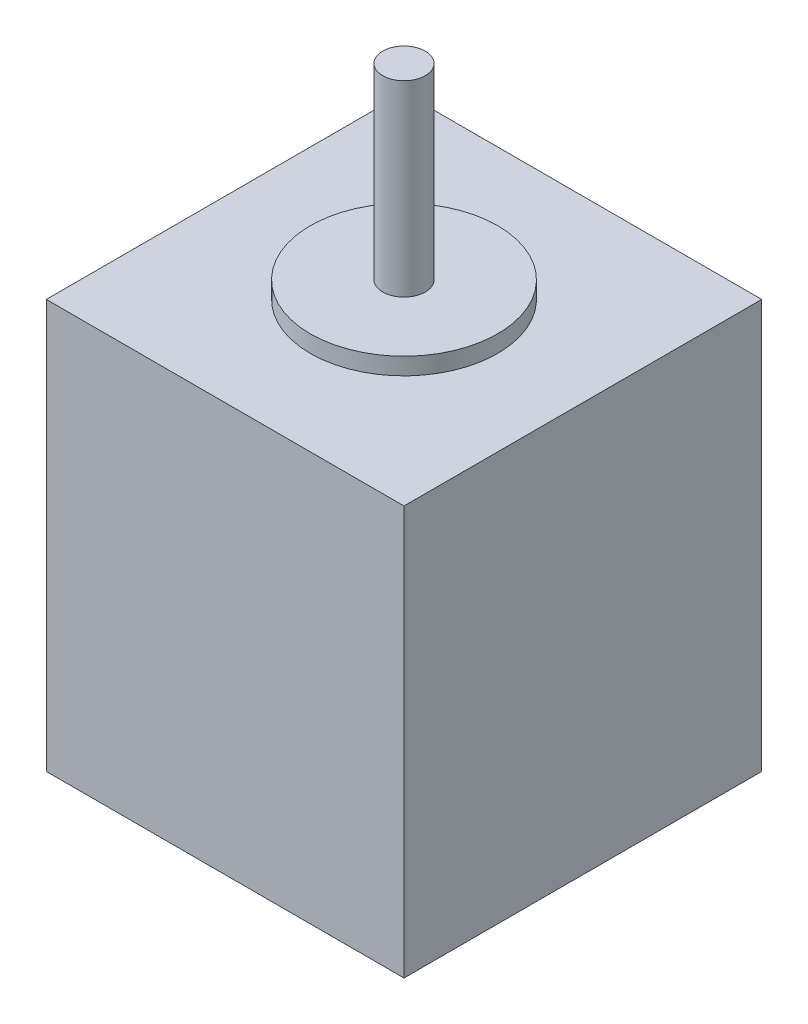
ISO-10303-21;
HEADER;
FILE_DESCRIPTION(('STEP AP214'),'2;1');
FILE_NAME('part.step','',(''),(''),'','','');
FILE_SCHEMA(('AUTOMOTIVE_DESIGN { 1 0 10303 214 1 1 1 1 }'));
ENDSEC;
DATA;
#1=APPLICATION_CONTEXT('core data for automotive mechanical design processes');
#2=APPLICATION_PROTOCOL_DEFINITION('international standard','automotive_design',2000,#1);
#3=PRODUCT_CONTEXT('',#1,'mechanical');
#4=PRODUCT('Part','Part','',(#3));
#5=PRODUCT_RELATED_PRODUCT_CATEGORY('part','',(#4));
#6=PRODUCT_DEFINITION_FORMATION('','',#4);
#7=PRODUCT_DEFINITION_CONTEXT('part definition',#1,'design');
#8=PRODUCT_DEFINITION('design','',#6,#7);
#9=PRODUCT_DEFINITION_SHAPE('','',#8);
#10=(LENGTH_UNIT() NAMED_UNIT(*) SI_UNIT(.MILLI.,.METRE.));
#11=(NAMED_UNIT(*) PLANE_ANGLE_UNIT() SI_UNIT($,.RADIAN.));
#12=(NAMED_UNIT(*) SI_UNIT($,.STERADIAN.) SOLID_ANGLE_UNIT());
#13=UNCERTAINTY_MEASURE_WITH_UNIT(LENGTH_MEASURE(1.E-05),#10,'distance_accuracy_value','');
#14=(GEOMETRIC_REPRESENTATION_CONTEXT(3) GLOBAL_UNCERTAINTY_ASSIGNED_CONTEXT((#13)) GLOBAL_UNIT_ASSIGNED_CONTEXT((#10,
#11,#12)) REPRESENTATION_CONTEXT('',''));
#15=CARTESIAN_POINT('',(0.,0.,0.));
#16=DIRECTION('',(0.,0.,1.));
#17=DIRECTION('',(1.,0.,0.));
#18=AXIS2_PLACEMENT_3D('',#15,#16,#17);
#19=CARTESIAN_POINT('',(-21.,-48.,21.));
#20=DIRECTION('',(0.,0.,1.));
#21=DIRECTION('',(1.,0.,0.));
#22=AXIS2_PLACEMENT_3D('',#19,#20,#21);
#23=PLANE('',#22);
#24=DIRECTION('',(1.,0.,0.));
#25=VECTOR('',#24,1.);
#26=CARTESIAN_POINT('',(-21.,0.,21.));
#27=LINE('',#26,#25);
#28=CARTESIAN_POINT('',(-21.,0.,21.));
#29=VERTEX_POINT('',#28);
#30=CARTESIAN_POINT('',(21.,0.,21.));
#31=VERTEX_POINT('',#30);
#32=EDGE_CURVE('E119',#29,#31,#27,.T.);
#33=ORIENTED_EDGE('',*,*,#32,.F.);
#34=DIRECTION('',(0.,1.,0.));
#35=VECTOR('',#34,1.);
#36=CARTESIAN_POINT('',(-21.,-48.,21.));
#37=LINE('',#36,#35);
#38=CARTESIAN_POINT('',(-21.,-48.,21.));
#39=VERTEX_POINT('',#38);
#40=EDGE_CURVE('E64',#39,#29,#37,.T.);
#41=ORIENTED_EDGE('',*,*,#40,.F.);
#42=DIRECTION('',(1.,0.,0.));
#43=VECTOR('',#42,1.);
#44=CARTESIAN_POINT('',(-21.,-48.,21.));
#45=LINE('',#44,#43);
#46=CARTESIAN_POINT('',(21.,-48.,21.));
#47=VERTEX_POINT('',#46);
#48=EDGE_CURVE('E110',#39,#47,#45,.T.);
#49=ORIENTED_EDGE('',*,*,#48,.T.);
#50=DIRECTION('',(0.,1.,0.));
#51=VECTOR('',#50,1.);
#52=CARTESIAN_POINT('',(21.,-48.,21.));
#53=LINE('',#52,#51);
#54=EDGE_CURVE('E48',#47,#31,#53,.T.);
#55=ORIENTED_EDGE('',*,*,#54,.T.);
#56=EDGE_LOOP('',(#33,#41,#49,#55));
#57=FACE_BOUND('',#56,.T.);
#58=ADVANCED_FACE('F45',(#57),#23,.T.);
#59=CARTESIAN_POINT('',(-21.,-48.,-21.));
#60=DIRECTION('',(-1.,0.,0.));
#61=DIRECTION('',(0.,0.,1.));
#62=AXIS2_PLACEMENT_3D('',#59,#60,#61);
#63=PLANE('',#62);
#64=DIRECTION('',(0.,0.,1.));
#65=VECTOR('',#64,1.);
#66=CARTESIAN_POINT('',(-21.,0.,-21.));
#67=LINE('',#66,#65);
#68=CARTESIAN_POINT('',(-21.,0.,-21.));
#69=VERTEX_POINT('',#68);
#70=EDGE_CURVE('E113',#69,#29,#67,.T.);
#71=ORIENTED_EDGE('',*,*,#70,.F.);
#72=DIRECTION('',(0.,1.,0.));
#73=VECTOR('',#72,1.);
#74=CARTESIAN_POINT('',(-21.,-48.,-21.));
#75=LINE('',#74,#73);
#76=CARTESIAN_POINT('',(-21.,-48.,-21.));
#77=VERTEX_POINT('',#76);
#78=EDGE_CURVE('E80',#77,#69,#75,.T.);
#79=ORIENTED_EDGE('',*,*,#78,.F.);
#80=DIRECTION('',(0.,0.,1.));
#81=VECTOR('',#80,1.);
#82=CARTESIAN_POINT('',(-21.,-48.,-21.));
#83=LINE('',#82,#81);
#84=EDGE_CURVE('E97',#77,#39,#83,.T.);
#85=ORIENTED_EDGE('',*,*,#84,.T.);
#86=ORIENTED_EDGE('',*,*,#40,.T.);
#87=EDGE_LOOP('',(#71,#79,#85,#86));
#88=FACE_BOUND('',#87,.T.);
#89=ADVANCED_FACE('F139',(#88),#63,.T.);
#90=CARTESIAN_POINT('',(-21.,-48.,-21.));
#91=DIRECTION('',(0.,0.,1.));
#92=DIRECTION('',(1.,0.,0.));
#93=AXIS2_PLACEMENT_3D('',#90,#91,#92);
#94=PLANE('',#93);
#95=DIRECTION('',(1.,0.,0.));
#96=VECTOR('',#95,1.);
#97=CARTESIAN_POINT('',(-21.,0.,-21.));
#98=LINE('',#97,#96);
#99=CARTESIAN_POINT('',(21.,0.,-21.));
#100=VERTEX_POINT('',#99);
#101=EDGE_CURVE('E103',#69,#100,#98,.T.);
#102=ORIENTED_EDGE('',*,*,#101,.T.);
#103=DIRECTION('',(0.,1.,0.));
#104=VECTOR('',#103,1.);
#105=CARTESIAN_POINT('',(21.,-48.,-21.));
#106=LINE('',#105,#104);
#107=CARTESIAN_POINT('',(21.,-48.,-21.));
#108=VERTEX_POINT('',#107);
#109=EDGE_CURVE('E101',#108,#100,#106,.T.);
#110=ORIENTED_EDGE('',*,*,#109,.F.);
#111=DIRECTION('',(1.,0.,0.));
#112=VECTOR('',#111,1.);
#113=CARTESIAN_POINT('',(-21.,-48.,-21.));
#114=LINE('',#113,#112);
#115=EDGE_CURVE('E94',#77,#108,#114,.T.);
#116=ORIENTED_EDGE('',*,*,#115,.F.);
#117=ORIENTED_EDGE('',*,*,#78,.T.);
#118=EDGE_LOOP('',(#102,#110,#116,#117));
#119=FACE_BOUND('',#118,.T.);
#120=ADVANCED_FACE('F102',(#119),#94,.F.);
#121=CARTESIAN_POINT('',(21.,-48.,-21.));
#122=DIRECTION('',(-1.,0.,0.));
#123=DIRECTION('',(0.,0.,1.));
#124=AXIS2_PLACEMENT_3D('',#121,#122,#123);
#125=PLANE('',#124);
#126=DIRECTION('',(0.,0.,1.));
#127=VECTOR('',#126,1.);
#128=CARTESIAN_POINT('',(21.,0.,-21.));
#129=LINE('',#128,#127);
#130=EDGE_CURVE('E123',#100,#31,#129,.T.);
#131=ORIENTED_EDGE('',*,*,#130,.T.);
#132=ORIENTED_EDGE('',*,*,#54,.F.);
#133=DIRECTION('',(0.,0.,1.));
#134=VECTOR('',#133,1.);
#135=CARTESIAN_POINT('',(21.,-48.,-21.));
#136=LINE('',#135,#134);
#137=EDGE_CURVE('E91',#108,#47,#136,.T.);
#138=ORIENTED_EDGE('',*,*,#137,.F.);
#139=ORIENTED_EDGE('',*,*,#109,.T.);
#140=EDGE_LOOP('',(#131,#132,#138,#139));
#141=FACE_BOUND('',#140,.T.);
#142=ADVANCED_FACE('F108',(#141),#125,.F.);
#143=CARTESIAN_POINT('',(0.,-48.,0.));
#144=DIRECTION('',(0.,-1.,0.));
#145=DIRECTION('',(0.,0.,-1.));
#146=AXIS2_PLACEMENT_3D('',#143,#144,#145);
#147=PLANE('',#146);
#148=ORIENTED_EDGE('',*,*,#48,.F.);
#149=ORIENTED_EDGE('',*,*,#84,.F.);
#150=ORIENTED_EDGE('',*,*,#115,.T.);
#151=ORIENTED_EDGE('',*,*,#137,.T.);
#152=EDGE_LOOP('',(#148,#149,#150,#151));
#153=FACE_BOUND('',#152,.T.);
#154=ADVANCED_FACE('F96',(#153),#147,.T.);
#155=CARTESIAN_POINT('',(0.,0.,0.));
#156=DIRECTION('',(0.,-1.,0.));
#157=DIRECTION('',(0.,0.,-1.));
#158=AXIS2_PLACEMENT_3D('',#155,#156,#157);
#159=PLANE('',#158);
#160=CARTESIAN_POINT('',(0.,0.,0.));
#161=DIRECTION('',(0.,1.,0.));
#162=DIRECTION('',(0.,0.,1.));
#163=AXIS2_PLACEMENT_3D('',#160,#161,#162);
#164=CIRCLE('',#163,11.);
#165=CARTESIAN_POINT('',(0.,0.,11.));
#166=VERTEX_POINT('',#165);
#167=EDGE_CURVE('E55',#166,#166,#164,.T.);
#168=ORIENTED_EDGE('',*,*,#167,.F.);
#169=EDGE_LOOP('',(#168));
#170=FACE_BOUND('',#169,.T.);
#171=ORIENTED_EDGE('',*,*,#32,.T.);
#172=ORIENTED_EDGE('',*,*,#130,.F.);
#173=ORIENTED_EDGE('',*,*,#101,.F.);
#174=ORIENTED_EDGE('',*,*,#70,.T.);
#175=EDGE_LOOP('',(#171,#172,#173,#174));
#176=FACE_BOUND('',#175,.T.);
#177=ADVANCED_FACE('F138',(#170,#176),#159,.F.);
#178=CARTESIAN_POINT('',(0.,2.,0.));
#179=DIRECTION('',(0.,-1.,0.));
#180=DIRECTION('',(0.,0.,-1.));
#181=AXIS2_PLACEMENT_3D('',#178,#179,#180);
#182=CYLINDRICAL_SURFACE('',#181,11.);
#183=CARTESIAN_POINT('',(0.,2.,0.));
#184=DIRECTION('',(0.,1.,0.));
#185=DIRECTION('',(0.,0.,1.));
#186=AXIS2_PLACEMENT_3D('',#183,#184,#185);
#187=CIRCLE('',#186,11.);
#188=CARTESIAN_POINT('',(0.,2.,11.));
#189=VERTEX_POINT('',#188);
#190=EDGE_CURVE('E124',#189,#189,#187,.T.);
#191=ORIENTED_EDGE('',*,*,#190,.F.);
#192=EDGE_LOOP('',(#191));
#193=FACE_BOUND('',#192,.T.);
#194=ORIENTED_EDGE('',*,*,#167,.T.);
#195=EDGE_LOOP('',(#194));
#196=FACE_BOUND('',#195,.T.);
#197=ADVANCED_FACE('F156',(#193,#196),#182,.T.);
#198=CARTESIAN_POINT('',(0.,2.,0.));
#199=DIRECTION('',(0.,1.,0.));
#200=DIRECTION('',(0.,0.,1.));
#201=AXIS2_PLACEMENT_3D('',#198,#199,#200);
#202=PLANE('',#201);
#203=CARTESIAN_POINT('',(0.,2.,0.));
#204=DIRECTION('',(0.,1.,0.));
#205=DIRECTION('',(0.,0.,1.));
#206=AXIS2_PLACEMENT_3D('',#203,#204,#205);
#207=CIRCLE('',#206,2.5);
#208=CARTESIAN_POINT('',(0.,2.,2.5));
#209=VERTEX_POINT('',#208);
#210=EDGE_CURVE('E11',#209,#209,#207,.T.);
#211=ORIENTED_EDGE('',*,*,#210,.F.);
#212=EDGE_LOOP('',(#211));
#213=FACE_BOUND('',#212,.T.);
#214=ORIENTED_EDGE('',*,*,#190,.T.);
#215=EDGE_LOOP('',(#214));
#216=FACE_BOUND('',#215,.T.);
#217=ADVANCED_FACE('F161',(#213,#216),#202,.T.);
#218=CARTESIAN_POINT('',(0.,24.,0.));
#219=DIRECTION('',(0.,-1.,0.));
#220=DIRECTION('',(0.,0.,-1.));
#221=AXIS2_PLACEMENT_3D('',#218,#219,#220);
#222=CYLINDRICAL_SURFACE('',#221,2.5);
#223=CARTESIAN_POINT('',(0.,24.,0.));
#224=DIRECTION('',(0.,1.,0.));
#225=DIRECTION('',(0.,0.,1.));
#226=AXIS2_PLACEMENT_3D('',#223,#224,#225);
#227=CIRCLE('',#226,2.5);
#228=CARTESIAN_POINT('',(0.,24.,2.5));
#229=VERTEX_POINT('',#228);
#230=EDGE_CURVE('E177',#229,#229,#227,.T.);
#231=ORIENTED_EDGE('',*,*,#230,.F.);
#232=EDGE_LOOP('',(#231));
#233=FACE_BOUND('',#232,.T.);
#234=ORIENTED_EDGE('',*,*,#210,.T.);
#235=EDGE_LOOP('',(#234));
#236=FACE_BOUND('',#235,.T.);
#237=ADVANCED_FACE('F165',(#233,#236),#222,.T.);
#238=CARTESIAN_POINT('',(0.,24.,0.));
#239=DIRECTION('',(0.,1.,0.));
#240=DIRECTION('',(0.,0.,1.));
#241=AXIS2_PLACEMENT_3D('',#238,#239,#240);
#242=PLANE('',#241);
#243=ORIENTED_EDGE('',*,*,#230,.T.);
#244=EDGE_LOOP('',(#243));
#245=FACE_BOUND('',#244,.T.);
#246=ADVANCED_FACE('F169',(#245),#242,.T.);
#247=CLOSED_SHELL('',(#58,#89,#120,#142,#154,#177,#197,#217,#237,#246));
#248=MANIFOLD_SOLID_BREP('B2',#247);
#249=ADVANCED_BREP_SHAPE_REPRESENTATION('',(#18,#248),#14);
#250=SHAPE_DEFINITION_REPRESENTATION(#9,#249);
ENDSEC;
END-ISO-10303-21;
